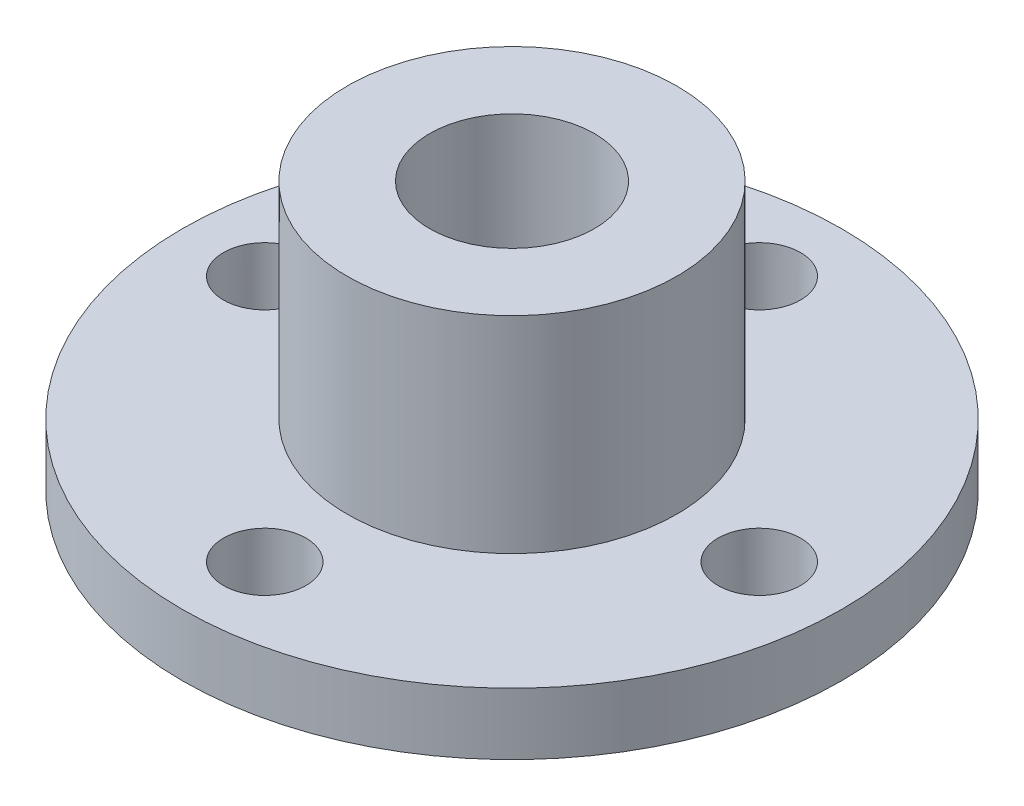
ISO-10303-21;
HEADER;
FILE_DESCRIPTION(('STEP AP214'),'2;1');
FILE_NAME('part.step','',(''),(''),'','','');
FILE_SCHEMA(('AUTOMOTIVE_DESIGN { 1 0 10303 214 1 1 1 1 }'));
ENDSEC;
DATA;
#1=APPLICATION_CONTEXT('core data for automotive mechanical design processes');
#2=APPLICATION_PROTOCOL_DEFINITION('international standard','automotive_design',2000,#1);
#3=PRODUCT_CONTEXT('',#1,'mechanical');
#4=PRODUCT('Part','Part','',(#3));
#5=PRODUCT_RELATED_PRODUCT_CATEGORY('part','',(#4));
#6=PRODUCT_DEFINITION_FORMATION('','',#4);
#7=PRODUCT_DEFINITION_CONTEXT('part definition',#1,'design');
#8=PRODUCT_DEFINITION('design','',#6,#7);
#9=PRODUCT_DEFINITION_SHAPE('','',#8);
#10=(LENGTH_UNIT() NAMED_UNIT(*) SI_UNIT(.MILLI.,.METRE.));
#11=(NAMED_UNIT(*) PLANE_ANGLE_UNIT() SI_UNIT($,.RADIAN.));
#12=(NAMED_UNIT(*) SI_UNIT($,.STERADIAN.) SOLID_ANGLE_UNIT());
#13=UNCERTAINTY_MEASURE_WITH_UNIT(LENGTH_MEASURE(1.E-05),#10,'distance_accuracy_value','');
#14=(GEOMETRIC_REPRESENTATION_CONTEXT(3) GLOBAL_UNCERTAINTY_ASSIGNED_CONTEXT((#13)) GLOBAL_UNIT_ASSIGNED_CONTEXT((#10,
#11,#12)) REPRESENTATION_CONTEXT('',''));
#15=CARTESIAN_POINT('',(0.,0.,0.));
#16=DIRECTION('',(0.,0.,1.));
#17=DIRECTION('',(1.,0.,0.));
#18=AXIS2_PLACEMENT_3D('',#15,#16,#17);
#19=CARTESIAN_POINT('',(4.,0.,0.));
#20=DIRECTION('',(0.,1.,0.));
#21=DIRECTION('',(0.,0.,1.));
#22=AXIS2_PLACEMENT_3D('',#19,#20,#21);
#23=PLANE('',#22);
#24=CARTESIAN_POINT('',(-4.,0.,0.));
#25=DIRECTION('',(0.,-1.,0.));
#26=DIRECTION('',(0.,0.,-1.));
#27=AXIS2_PLACEMENT_3D('',#24,#25,#26);
#28=CIRCLE('',#27,4.);
#29=CARTESIAN_POINT('',(-4.,0.,-4.));
#30=VERTEX_POINT('',#29);
#31=EDGE_CURVE('E10',#30,#30,#28,.T.);
#32=ORIENTED_EDGE('',*,*,#31,.T.);
#33=EDGE_LOOP('',(#32));
#34=FACE_BOUND('',#33,.T.);
#35=CARTESIAN_POINT('',(-4.,0.,0.));
#36=DIRECTION('',(0.,-1.,0.));
#37=DIRECTION('',(0.,0.,-1.));
#38=AXIS2_PLACEMENT_3D('',#35,#36,#37);
#39=CIRCLE('',#38,8.);
#40=CARTESIAN_POINT('',(-4.,0.,-8.));
#41=VERTEX_POINT('',#40);
#42=EDGE_CURVE('E59',#41,#41,#39,.T.);
#43=ORIENTED_EDGE('',*,*,#42,.F.);
#44=EDGE_LOOP('',(#43));
#45=FACE_BOUND('',#44,.T.);
#46=ADVANCED_FACE('F37',(#34,#45),#23,.T.);
#47=CARTESIAN_POINT('',(-4.,-13.,0.));
#48=DIRECTION('',(0.,-1.,0.));
#49=DIRECTION('',(0.,0.,-1.));
#50=AXIS2_PLACEMENT_3D('',#47,#48,#49);
#51=CYLINDRICAL_SURFACE('',#50,4.);
#52=CARTESIAN_POINT('',(-4.,-13.,0.));
#53=DIRECTION('',(0.,-1.,0.));
#54=DIRECTION('',(0.,0.,-1.));
#55=AXIS2_PLACEMENT_3D('',#52,#53,#54);
#56=CIRCLE('',#55,4.);
#57=CARTESIAN_POINT('',(-4.,-13.,-4.));
#58=VERTEX_POINT('',#57);
#59=EDGE_CURVE('E43',#58,#58,#56,.T.);
#60=ORIENTED_EDGE('',*,*,#59,.T.);
#61=EDGE_LOOP('',(#60));
#62=FACE_BOUND('',#61,.T.);
#63=ORIENTED_EDGE('',*,*,#31,.F.);
#64=EDGE_LOOP('',(#63));
#65=FACE_BOUND('',#64,.T.);
#66=ADVANCED_FACE('F114',(#62,#65),#51,.F.);
#67=CARTESIAN_POINT('',(0.,-13.,0.));
#68=DIRECTION('',(0.,-1.,0.));
#69=DIRECTION('',(0.,0.,-1.));
#70=AXIS2_PLACEMENT_3D('',#67,#68,#69);
#71=PLANE('',#70);
#72=CARTESIAN_POINT('',(8.,-13.,0.));
#73=DIRECTION('',(0.,-1.,0.));
#74=DIRECTION('',(0.,0.,-1.));
#75=AXIS2_PLACEMENT_3D('',#72,#73,#74);
#76=CIRCLE('',#75,2.);
#77=CARTESIAN_POINT('',(8.,-13.,-1.99999999999996));
#78=VERTEX_POINT('',#77);
#79=EDGE_CURVE('E68',#78,#78,#76,.F.);
#80=ORIENTED_EDGE('',*,*,#79,.T.);
#81=EDGE_LOOP('',(#80));
#82=FACE_BOUND('',#81,.T.);
#83=CARTESIAN_POINT('',(-4.,-13.,12.));
#84=DIRECTION('',(0.,-1.,0.));
#85=DIRECTION('',(0.,0.,-1.));
#86=AXIS2_PLACEMENT_3D('',#83,#84,#85);
#87=CIRCLE('',#86,2.);
#88=CARTESIAN_POINT('',(-4.,-13.,10.));
#89=VERTEX_POINT('',#88);
#90=EDGE_CURVE('E76',#89,#89,#87,.F.);
#91=ORIENTED_EDGE('',*,*,#90,.T.);
#92=EDGE_LOOP('',(#91));
#93=FACE_BOUND('',#92,.T.);
#94=CARTESIAN_POINT('',(-16.,-13.,-1.25767452008319E-13));
#95=DIRECTION('',(0.,-1.,0.));
#96=DIRECTION('',(0.,0.,-1.));
#97=AXIS2_PLACEMENT_3D('',#94,#95,#96);
#98=CIRCLE('',#97,2.);
#99=CARTESIAN_POINT('',(-16.,-13.,-2.00000000000013));
#100=VERTEX_POINT('',#99);
#101=EDGE_CURVE('E69',#100,#100,#98,.F.);
#102=ORIENTED_EDGE('',*,*,#101,.T.);
#103=EDGE_LOOP('',(#102));
#104=FACE_BOUND('',#103,.T.);
#105=CARTESIAN_POINT('',(-4.,-13.,-12.));
#106=DIRECTION('',(0.,-1.,0.));
#107=DIRECTION('',(0.,0.,-1.));
#108=AXIS2_PLACEMENT_3D('',#105,#106,#107);
#109=CIRCLE('',#108,2.);
#110=CARTESIAN_POINT('',(-4.,-13.,-14.));
#111=VERTEX_POINT('',#110);
#112=EDGE_CURVE('E62',#111,#111,#109,.F.);
#113=ORIENTED_EDGE('',*,*,#112,.T.);
#114=EDGE_LOOP('',(#113));
#115=FACE_BOUND('',#114,.T.);
#116=CARTESIAN_POINT('',(-4.,-13.,0.));
#117=DIRECTION('',(0.,-1.,0.));
#118=DIRECTION('',(0.,0.,-1.));
#119=AXIS2_PLACEMENT_3D('',#116,#117,#118);
#120=CIRCLE('',#119,16.);
#121=CARTESIAN_POINT('',(-4.,-13.,-16.));
#122=VERTEX_POINT('',#121);
#123=EDGE_CURVE('E47',#122,#122,#120,.T.);
#124=ORIENTED_EDGE('',*,*,#123,.T.);
#125=EDGE_LOOP('',(#124));
#126=FACE_BOUND('',#125,.T.);
#127=ORIENTED_EDGE('',*,*,#59,.F.);
#128=EDGE_LOOP('',(#127));
#129=FACE_BOUND('',#128,.T.);
#130=ADVANCED_FACE('F108',(#82,#93,#104,#115,#126,#129),#71,.T.);
#131=CARTESIAN_POINT('',(-4.,-13.,0.));
#132=DIRECTION('',(0.,-1.,0.));
#133=DIRECTION('',(0.,0.,-1.));
#134=AXIS2_PLACEMENT_3D('',#131,#132,#133);
#135=CYLINDRICAL_SURFACE('',#134,16.);
#136=CARTESIAN_POINT('',(-4.,-10.,0.));
#137=DIRECTION('',(0.,-1.,0.));
#138=DIRECTION('',(0.,0.,-1.));
#139=AXIS2_PLACEMENT_3D('',#136,#137,#138);
#140=CIRCLE('',#139,16.);
#141=CARTESIAN_POINT('',(-4.,-10.,-16.));
#142=VERTEX_POINT('',#141);
#143=EDGE_CURVE('E51',#142,#142,#140,.T.);
#144=ORIENTED_EDGE('',*,*,#143,.T.);
#145=EDGE_LOOP('',(#144));
#146=FACE_BOUND('',#145,.T.);
#147=ORIENTED_EDGE('',*,*,#123,.F.);
#148=EDGE_LOOP('',(#147));
#149=FACE_BOUND('',#148,.T.);
#150=ADVANCED_FACE('F94',(#146,#149),#135,.T.);
#151=CARTESIAN_POINT('',(12.,-10.,0.));
#152=DIRECTION('',(0.,1.,0.));
#153=DIRECTION('',(0.,0.,1.));
#154=AXIS2_PLACEMENT_3D('',#151,#152,#153);
#155=PLANE('',#154);
#156=CARTESIAN_POINT('',(8.,-10.,0.));
#157=DIRECTION('',(0.,1.,0.));
#158=DIRECTION('',(-1.,0.,0.));
#159=AXIS2_PLACEMENT_3D('',#156,#157,#158);
#160=CIRCLE('',#159,2.);
#161=CARTESIAN_POINT('',(6.,-10.,0.));
#162=VERTEX_POINT('',#161);
#163=EDGE_CURVE('E79',#162,#162,#160,.T.);
#164=ORIENTED_EDGE('',*,*,#163,.F.);
#165=EDGE_LOOP('',(#164));
#166=FACE_BOUND('',#165,.T.);
#167=CARTESIAN_POINT('',(-4.,-10.,12.));
#168=DIRECTION('',(0.,1.,0.));
#169=DIRECTION('',(0.,0.,-1.));
#170=AXIS2_PLACEMENT_3D('',#167,#168,#169);
#171=CIRCLE('',#170,2.);
#172=CARTESIAN_POINT('',(-4.,-10.,10.));
#173=VERTEX_POINT('',#172);
#174=EDGE_CURVE('E72',#173,#173,#171,.T.);
#175=ORIENTED_EDGE('',*,*,#174,.F.);
#176=EDGE_LOOP('',(#175));
#177=FACE_BOUND('',#176,.T.);
#178=CARTESIAN_POINT('',(-16.,-10.,-1.25767452008319E-13));
#179=DIRECTION('',(0.,1.,0.));
#180=DIRECTION('',(1.,0.,0.));
#181=AXIS2_PLACEMENT_3D('',#178,#179,#180);
#182=CIRCLE('',#181,2.);
#183=CARTESIAN_POINT('',(-14.,-10.,-1.0481856397526E-13));
#184=VERTEX_POINT('',#183);
#185=EDGE_CURVE('E73',#184,#184,#182,.T.);
#186=ORIENTED_EDGE('',*,*,#185,.F.);
#187=EDGE_LOOP('',(#186));
#188=FACE_BOUND('',#187,.T.);
#189=CARTESIAN_POINT('',(-4.,-10.,-12.));
#190=DIRECTION('',(0.,1.,0.));
#191=DIRECTION('',(0.,0.,1.));
#192=AXIS2_PLACEMENT_3D('',#189,#190,#191);
#193=CIRCLE('',#192,2.);
#194=CARTESIAN_POINT('',(-4.,-10.,-10.));
#195=VERTEX_POINT('',#194);
#196=EDGE_CURVE('E65',#195,#195,#193,.T.);
#197=ORIENTED_EDGE('',*,*,#196,.F.);
#198=EDGE_LOOP('',(#197));
#199=FACE_BOUND('',#198,.T.);
#200=CARTESIAN_POINT('',(-4.,-10.,0.));
#201=DIRECTION('',(0.,-1.,0.));
#202=DIRECTION('',(0.,0.,-1.));
#203=AXIS2_PLACEMENT_3D('',#200,#201,#202);
#204=CIRCLE('',#203,8.);
#205=CARTESIAN_POINT('',(-4.,-10.,-8.));
#206=VERTEX_POINT('',#205);
#207=EDGE_CURVE('E56',#206,#206,#204,.T.);
#208=ORIENTED_EDGE('',*,*,#207,.T.);
#209=EDGE_LOOP('',(#208));
#210=FACE_BOUND('',#209,.T.);
#211=ORIENTED_EDGE('',*,*,#143,.F.);
#212=EDGE_LOOP('',(#211));
#213=FACE_BOUND('',#212,.T.);
#214=ADVANCED_FACE('F90',(#166,#177,#188,#199,#210,#213),#155,.T.);
#215=CARTESIAN_POINT('',(-4.,-13.,0.));
#216=DIRECTION('',(0.,-1.,0.));
#217=DIRECTION('',(0.,0.,-1.));
#218=AXIS2_PLACEMENT_3D('',#215,#216,#217);
#219=CYLINDRICAL_SURFACE('',#218,8.);
#220=ORIENTED_EDGE('',*,*,#42,.T.);
#221=EDGE_LOOP('',(#220));
#222=FACE_BOUND('',#221,.T.);
#223=ORIENTED_EDGE('',*,*,#207,.F.);
#224=EDGE_LOOP('',(#223));
#225=FACE_BOUND('',#224,.T.);
#226=ADVANCED_FACE('F93',(#222,#225),#219,.T.);
#227=CARTESIAN_POINT('',(-4.,-18.6568542494924,-12.));
#228=DIRECTION('',(0.,1.,0.));
#229=DIRECTION('',(0.,0.,1.));
#230=AXIS2_PLACEMENT_3D('',#227,#228,#229);
#231=CYLINDRICAL_SURFACE('',#230,2.);
#232=ORIENTED_EDGE('',*,*,#196,.T.);
#233=EDGE_LOOP('',(#232));
#234=FACE_BOUND('',#233,.T.);
#235=ORIENTED_EDGE('',*,*,#112,.F.);
#236=EDGE_LOOP('',(#235));
#237=FACE_BOUND('',#236,.T.);
#238=ADVANCED_FACE('F129',(#234,#237),#231,.F.);
#239=CARTESIAN_POINT('',(-16.,-18.6568542494924,-1.25767452008319E-13));
#240=DIRECTION('',(0.,1.,0.));
#241=DIRECTION('',(0.,0.,1.));
#242=AXIS2_PLACEMENT_3D('',#239,#240,#241);
#243=CYLINDRICAL_SURFACE('',#242,2.);
#244=ORIENTED_EDGE('',*,*,#185,.T.);
#245=EDGE_LOOP('',(#244));
#246=FACE_BOUND('',#245,.T.);
#247=ORIENTED_EDGE('',*,*,#101,.F.);
#248=EDGE_LOOP('',(#247));
#249=FACE_BOUND('',#248,.T.);
#250=ADVANCED_FACE('F134',(#246,#249),#243,.F.);
#251=CARTESIAN_POINT('',(-4.,-18.6568542494924,12.));
#252=DIRECTION('',(0.,1.,0.));
#253=DIRECTION('',(0.,0.,1.));
#254=AXIS2_PLACEMENT_3D('',#251,#252,#253);
#255=CYLINDRICAL_SURFACE('',#254,2.);
#256=ORIENTED_EDGE('',*,*,#174,.T.);
#257=EDGE_LOOP('',(#256));
#258=FACE_BOUND('',#257,.T.);
#259=ORIENTED_EDGE('',*,*,#90,.F.);
#260=EDGE_LOOP('',(#259));
#261=FACE_BOUND('',#260,.T.);
#262=ADVANCED_FACE('F140',(#258,#261),#255,.F.);
#263=CARTESIAN_POINT('',(8.,-18.6568542494924,0.));
#264=DIRECTION('',(0.,1.,0.));
#265=DIRECTION('',(0.,0.,1.));
#266=AXIS2_PLACEMENT_3D('',#263,#264,#265);
#267=CYLINDRICAL_SURFACE('',#266,2.);
#268=ORIENTED_EDGE('',*,*,#163,.T.);
#269=EDGE_LOOP('',(#268));
#270=FACE_BOUND('',#269,.T.);
#271=ORIENTED_EDGE('',*,*,#79,.F.);
#272=EDGE_LOOP('',(#271));
#273=FACE_BOUND('',#272,.T.);
#274=ADVANCED_FACE('F87',(#270,#273),#267,.F.);
#275=CLOSED_SHELL('',(#46,#66,#130,#150,#214,#226,#238,#250,#262,#274));
#276=MANIFOLD_SOLID_BREP('B2',#275);
#277=ADVANCED_BREP_SHAPE_REPRESENTATION('',(#18,#276),#14);
#278=SHAPE_DEFINITION_REPRESENTATION(#9,#277);
ENDSEC;
END-ISO-10303-21;
